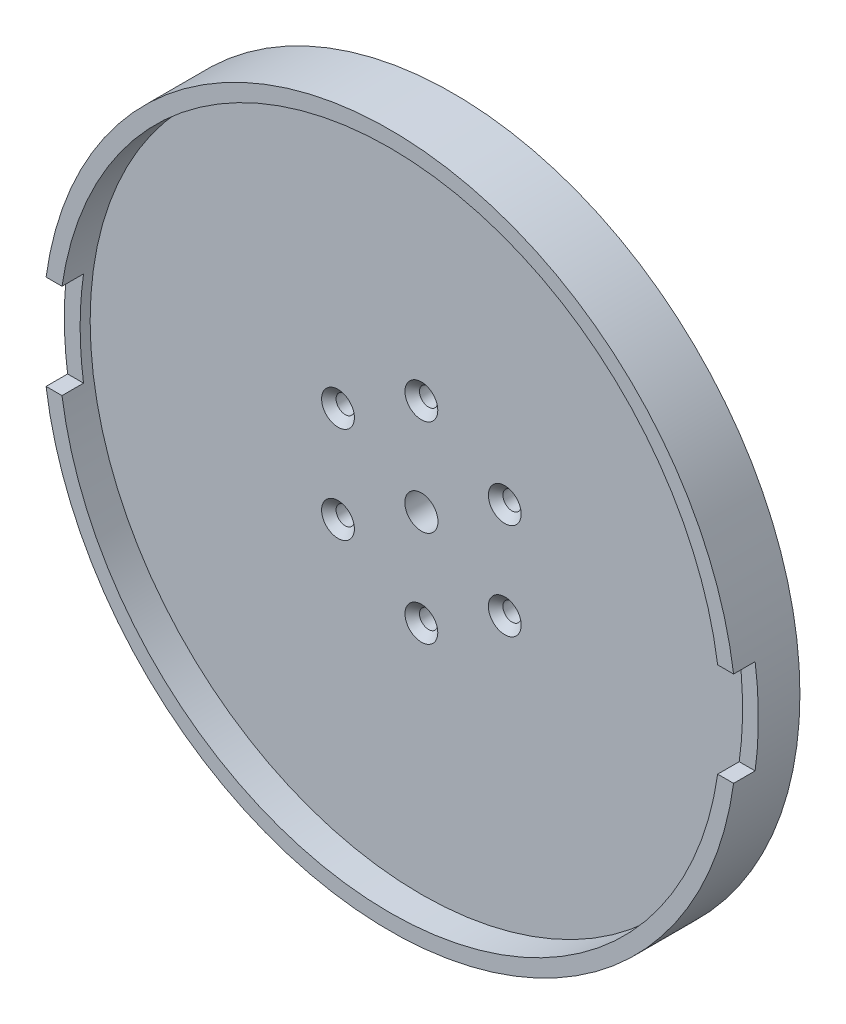
ISO-10303-21;
HEADER;
FILE_DESCRIPTION(('STEP AP214'),'2;1');
FILE_NAME('part.step','',(''),(''),'','','');
FILE_SCHEMA(('AUTOMOTIVE_DESIGN { 1 0 10303 214 1 1 1 1 }'));
ENDSEC;
DATA;
#1=APPLICATION_CONTEXT('core data for automotive mechanical design processes');
#2=APPLICATION_PROTOCOL_DEFINITION('international standard','automotive_design',2000,#1);
#3=PRODUCT_CONTEXT('',#1,'mechanical');
#4=PRODUCT('Part','Part','',(#3));
#5=PRODUCT_RELATED_PRODUCT_CATEGORY('part','',(#4));
#6=PRODUCT_DEFINITION_FORMATION('','',#4);
#7=PRODUCT_DEFINITION_CONTEXT('part definition',#1,'design');
#8=PRODUCT_DEFINITION('design','',#6,#7);
#9=PRODUCT_DEFINITION_SHAPE('','',#8);
#10=(LENGTH_UNIT() NAMED_UNIT(*) SI_UNIT(.MILLI.,.METRE.));
#11=(NAMED_UNIT(*) PLANE_ANGLE_UNIT() SI_UNIT($,.RADIAN.));
#12=(NAMED_UNIT(*) SI_UNIT($,.STERADIAN.) SOLID_ANGLE_UNIT());
#13=UNCERTAINTY_MEASURE_WITH_UNIT(LENGTH_MEASURE(1.E-05),#10,'distance_accuracy_value','');
#14=(GEOMETRIC_REPRESENTATION_CONTEXT(3) GLOBAL_UNCERTAINTY_ASSIGNED_CONTEXT((#13)) GLOBAL_UNIT_ASSIGNED_CONTEXT((#10,
#11,#12)) REPRESENTATION_CONTEXT('',''));
#15=CARTESIAN_POINT('',(0.,0.,0.));
#16=DIRECTION('',(0.,0.,1.));
#17=DIRECTION('',(1.,0.,0.));
#18=AXIS2_PLACEMENT_3D('',#15,#16,#17);
#19=CARTESIAN_POINT('',(0.,0.,10.));
#20=DIRECTION('',(0.,0.,-1.));
#21=DIRECTION('',(-1.,0.,0.));
#22=AXIS2_PLACEMENT_3D('',#19,#20,#21);
#23=PLANE('',#22);
#24=DIRECTION('',(1.,0.,0.));
#25=VECTOR('',#24,1.);
#26=CARTESIAN_POINT('',(-110.,-15.,10.));
#27=LINE('',#26,#25);
#28=CARTESIAN_POINT('',(-108.972473588517,-15.,10.));
#29=VERTEX_POINT('',#28);
#30=CARTESIAN_POINT('',(-103.923048454133,-15.,10.));
#31=VERTEX_POINT('',#30);
#32=EDGE_CURVE('E72',#29,#31,#27,.T.);
#33=ORIENTED_EDGE('',*,*,#32,.F.);
#34=CARTESIAN_POINT('',(0.,0.,10.));
#35=DIRECTION('',(0.,0.,-1.));
#36=DIRECTION('',(-1.,0.,0.));
#37=AXIS2_PLACEMENT_3D('',#34,#35,#36);
#38=CIRCLE('',#37,110.);
#39=CARTESIAN_POINT('',(108.972473588517,-15.,10.));
#40=VERTEX_POINT('',#39);
#41=EDGE_CURVE('E138',#40,#29,#38,.T.);
#42=ORIENTED_EDGE('',*,*,#41,.F.);
#43=CARTESIAN_POINT('',(103.923048454133,-15.,10.));
#44=VERTEX_POINT('',#43);
#45=EDGE_CURVE('E226',#44,#40,#27,.T.);
#46=ORIENTED_EDGE('',*,*,#45,.F.);
#47=CARTESIAN_POINT('',(0.,0.,10.));
#48=DIRECTION('',(0.,0.,-1.));
#49=DIRECTION('',(-1.,0.,0.));
#50=AXIS2_PLACEMENT_3D('',#47,#48,#49);
#51=CIRCLE('',#50,105.);
#52=EDGE_CURVE('E158',#44,#31,#51,.T.);
#53=ORIENTED_EDGE('',*,*,#52,.T.);
#54=EDGE_LOOP('',(#33,#42,#46,#53));
#55=FACE_BOUND('',#54,.T.);
#56=ADVANCED_FACE('F47',(#55),#23,.F.);
#57=CARTESIAN_POINT('',(0.,0.,10.));
#58=DIRECTION('',(0.,0.,-1.));
#59=DIRECTION('',(-1.,0.,0.));
#60=AXIS2_PLACEMENT_3D('',#57,#58,#59);
#61=CYLINDRICAL_SURFACE('',#60,110.);
#62=CARTESIAN_POINT('',(0.,0.,3.17499999999999));
#63=DIRECTION('',(0.,0.,-1.));
#64=DIRECTION('',(-1.,0.,0.));
#65=AXIS2_PLACEMENT_3D('',#62,#63,#64);
#66=CIRCLE('',#65,110.);
#67=CARTESIAN_POINT('',(108.972473588517,-15.,3.17499999999999));
#68=VERTEX_POINT('',#67);
#69=CARTESIAN_POINT('',(108.972473588517,15.,3.17499999999999));
#70=VERTEX_POINT('',#69);
#71=EDGE_CURVE('E125',#68,#70,#66,.F.);
#72=ORIENTED_EDGE('',*,*,#71,.F.);
#73=DIRECTION('',(0.,0.,-1.));
#74=VECTOR('',#73,1.);
#75=CARTESIAN_POINT('',(108.972473588517,-15.,10.));
#76=LINE('',#75,#74);
#77=EDGE_CURVE('E126',#68,#40,#76,.F.);
#78=ORIENTED_EDGE('',*,*,#77,.T.);
#79=ORIENTED_EDGE('',*,*,#41,.T.);
#80=DIRECTION('',(0.,0.,-1.));
#81=VECTOR('',#80,1.);
#82=CARTESIAN_POINT('',(-108.972473588517,-15.,10.));
#83=LINE('',#82,#81);
#84=CARTESIAN_POINT('',(-108.972473588517,-15.,3.17499999999999));
#85=VERTEX_POINT('',#84);
#86=EDGE_CURVE('E129',#29,#85,#83,.T.);
#87=ORIENTED_EDGE('',*,*,#86,.T.);
#88=CARTESIAN_POINT('',(-108.972473588517,15.,3.17499999999999));
#89=VERTEX_POINT('',#88);
#90=EDGE_CURVE('E114',#89,#85,#66,.F.);
#91=ORIENTED_EDGE('',*,*,#90,.F.);
#92=DIRECTION('',(0.,0.,-1.));
#93=VECTOR('',#92,1.);
#94=CARTESIAN_POINT('',(-108.972473588517,15.,10.));
#95=LINE('',#94,#93);
#96=CARTESIAN_POINT('',(-108.972473588517,15.,10.));
#97=VERTEX_POINT('',#96);
#98=EDGE_CURVE('E147',#97,#89,#95,.T.);
#99=ORIENTED_EDGE('',*,*,#98,.F.);
#100=CARTESIAN_POINT('',(108.972473588517,15.,10.));
#101=VERTEX_POINT('',#100);
#102=EDGE_CURVE('E162',#97,#101,#38,.T.);
#103=ORIENTED_EDGE('',*,*,#102,.T.);
#104=DIRECTION('',(0.,0.,-1.));
#105=VECTOR('',#104,1.);
#106=CARTESIAN_POINT('',(108.972473588517,15.,10.));
#107=LINE('',#106,#105);
#108=EDGE_CURVE('E149',#70,#101,#107,.F.);
#109=ORIENTED_EDGE('',*,*,#108,.F.);
#110=EDGE_LOOP('',(#72,#78,#79,#87,#91,#99,#103,#109));
#111=FACE_BOUND('',#110,.T.);
#112=CARTESIAN_POINT('',(0.,0.,-10.));
#113=DIRECTION('',(0.,0.,-1.));
#114=DIRECTION('',(-1.,0.,0.));
#115=AXIS2_PLACEMENT_3D('',#112,#113,#114);
#116=CIRCLE('',#115,110.);
#117=CARTESIAN_POINT('',(-110.,0.,-10.));
#118=VERTEX_POINT('',#117);
#119=EDGE_CURVE('E151',#118,#118,#116,.T.);
#120=ORIENTED_EDGE('',*,*,#119,.F.);
#121=EDGE_LOOP('',(#120));
#122=FACE_BOUND('',#121,.T.);
#123=ADVANCED_FACE('F49',(#111,#122),#61,.T.);
#124=ORIENTED_EDGE('',*,*,#102,.F.);
#125=DIRECTION('',(1.,0.,0.));
#126=VECTOR('',#125,1.);
#127=CARTESIAN_POINT('',(-110.,15.,10.));
#128=LINE('',#127,#126);
#129=CARTESIAN_POINT('',(-103.923048454133,15.,10.));
#130=VERTEX_POINT('',#129);
#131=EDGE_CURVE('E139',#97,#130,#128,.T.);
#132=ORIENTED_EDGE('',*,*,#131,.T.);
#133=CARTESIAN_POINT('',(103.923048454133,15.,10.));
#134=VERTEX_POINT('',#133);
#135=EDGE_CURVE('E155',#130,#134,#51,.T.);
#136=ORIENTED_EDGE('',*,*,#135,.T.);
#137=EDGE_CURVE('E143',#134,#101,#128,.T.);
#138=ORIENTED_EDGE('',*,*,#137,.T.);
#139=EDGE_LOOP('',(#124,#132,#136,#138));
#140=FACE_BOUND('',#139,.T.);
#141=ADVANCED_FACE('F236',(#140),#23,.F.);
#142=CARTESIAN_POINT('',(0.,0.,10.));
#143=DIRECTION('',(0.,0.,-1.));
#144=DIRECTION('',(-1.,0.,0.));
#145=AXIS2_PLACEMENT_3D('',#142,#143,#144);
#146=CYLINDRICAL_SURFACE('',#145,105.);
#147=CARTESIAN_POINT('',(0.,0.,3.17499999999999));
#148=DIRECTION('',(0.,0.,-1.));
#149=DIRECTION('',(-1.,0.,0.));
#150=AXIS2_PLACEMENT_3D('',#147,#148,#149);
#151=CIRCLE('',#150,105.);
#152=CARTESIAN_POINT('',(103.923048454133,-15.,3.17499999999999));
#153=VERTEX_POINT('',#152);
#154=CARTESIAN_POINT('',(103.923048454133,15.,3.17499999999999));
#155=VERTEX_POINT('',#154);
#156=EDGE_CURVE('E56',#153,#155,#151,.F.);
#157=ORIENTED_EDGE('',*,*,#156,.T.);
#158=DIRECTION('',(0.,0.,-1.));
#159=VECTOR('',#158,1.);
#160=CARTESIAN_POINT('',(103.923048454133,15.,10.));
#161=LINE('',#160,#159);
#162=EDGE_CURVE('E11',#155,#134,#161,.F.);
#163=ORIENTED_EDGE('',*,*,#162,.T.);
#164=ORIENTED_EDGE('',*,*,#135,.F.);
#165=DIRECTION('',(0.,0.,-1.));
#166=VECTOR('',#165,1.);
#167=CARTESIAN_POINT('',(-103.923048454133,15.,10.));
#168=LINE('',#167,#166);
#169=CARTESIAN_POINT('',(-103.923048454133,15.,3.17499999999999));
#170=VERTEX_POINT('',#169);
#171=EDGE_CURVE('E166',#130,#170,#168,.T.);
#172=ORIENTED_EDGE('',*,*,#171,.T.);
#173=CARTESIAN_POINT('',(-103.923048454133,-15.,3.17499999999999));
#174=VERTEX_POINT('',#173);
#175=EDGE_CURVE('E164',#170,#174,#151,.F.);
#176=ORIENTED_EDGE('',*,*,#175,.T.);
#177=DIRECTION('',(0.,0.,-1.));
#178=VECTOR('',#177,1.);
#179=CARTESIAN_POINT('',(-103.923048454133,-15.,10.));
#180=LINE('',#179,#178);
#181=EDGE_CURVE('E130',#31,#174,#180,.T.);
#182=ORIENTED_EDGE('',*,*,#181,.F.);
#183=ORIENTED_EDGE('',*,*,#52,.F.);
#184=DIRECTION('',(0.,0.,-1.));
#185=VECTOR('',#184,1.);
#186=CARTESIAN_POINT('',(103.923048454133,-15.,10.));
#187=LINE('',#186,#185);
#188=EDGE_CURVE('E169',#153,#44,#187,.F.);
#189=ORIENTED_EDGE('',*,*,#188,.F.);
#190=EDGE_LOOP('',(#157,#163,#164,#172,#176,#182,#183,#189));
#191=FACE_BOUND('',#190,.T.);
#192=CARTESIAN_POINT('',(0.,0.,0.));
#193=DIRECTION('',(0.,0.,-1.));
#194=DIRECTION('',(-1.,0.,0.));
#195=AXIS2_PLACEMENT_3D('',#192,#193,#194);
#196=CIRCLE('',#195,105.);
#197=CARTESIAN_POINT('',(-105.,0.,0.));
#198=VERTEX_POINT('',#197);
#199=EDGE_CURVE('E154',#198,#198,#196,.T.);
#200=ORIENTED_EDGE('',*,*,#199,.T.);
#201=EDGE_LOOP('',(#200));
#202=FACE_BOUND('',#201,.T.);
#203=ADVANCED_FACE('F241',(#191,#202),#146,.F.);
#204=CARTESIAN_POINT('',(0.,0.,0.));
#205=DIRECTION('',(0.,0.,-1.));
#206=DIRECTION('',(-1.,0.,0.));
#207=AXIS2_PLACEMENT_3D('',#204,#205,#206);
#208=PLANE('',#207);
#209=CARTESIAN_POINT('',(-26.4325902286166,-15.2624999999945,0.));
#210=DIRECTION('',(0.,0.,1.));
#211=DIRECTION('',(1.,0.,0.));
#212=AXIS2_PLACEMENT_3D('',#209,#210,#211);
#213=CIRCLE('',#212,5.2);
#214=CARTESIAN_POINT('',(-21.2325902286166,-15.2624999999945,0.));
#215=VERTEX_POINT('',#214);
#216=EDGE_CURVE('E504',#215,#215,#213,.T.);
#217=ORIENTED_EDGE('',*,*,#216,.F.);
#218=EDGE_LOOP('',(#217));
#219=FACE_BOUND('',#218,.T.);
#220=CARTESIAN_POINT('',(-26.4325902286102,15.2625000000056,0.));
#221=DIRECTION('',(0.,0.,1.));
#222=DIRECTION('',(1.,0.,0.));
#223=AXIS2_PLACEMENT_3D('',#220,#221,#222);
#224=CIRCLE('',#223,5.2);
#225=CARTESIAN_POINT('',(-21.2325902286102,15.2625000000056,0.));
#226=VERTEX_POINT('',#225);
#227=EDGE_CURVE('E199',#226,#226,#224,.T.);
#228=ORIENTED_EDGE('',*,*,#227,.F.);
#229=EDGE_LOOP('',(#228));
#230=FACE_BOUND('',#229,.T.);
#231=CARTESIAN_POINT('',(0.00283522191306396,30.525,0.));
#232=DIRECTION('',(0.,0.,1.));
#233=DIRECTION('',(1.,0.,0.));
#234=AXIS2_PLACEMENT_3D('',#231,#232,#233);
#235=CIRCLE('',#234,5.2);
#236=CARTESIAN_POINT('',(5.20283522191306,30.525,0.));
#237=VERTEX_POINT('',#236);
#238=EDGE_CURVE('E192',#237,#237,#235,.T.);
#239=ORIENTED_EDGE('',*,*,#238,.F.);
#240=EDGE_LOOP('',(#239));
#241=FACE_BOUND('',#240,.T.);
#242=CARTESIAN_POINT('',(26.4382606724299,15.2624999999943,0.));
#243=DIRECTION('',(0.,0.,1.));
#244=DIRECTION('',(1.,0.,0.));
#245=AXIS2_PLACEMENT_3D('',#242,#243,#244);
#246=CIRCLE('',#245,5.2);
#247=CARTESIAN_POINT('',(31.6382606724299,15.2624999999943,0.));
#248=VERTEX_POINT('',#247);
#249=EDGE_CURVE('E188',#248,#248,#246,.T.);
#250=ORIENTED_EDGE('',*,*,#249,.F.);
#251=EDGE_LOOP('',(#250));
#252=FACE_BOUND('',#251,.T.);
#253=CARTESIAN_POINT('',(26.4382606724233,-15.2625000000057,0.));
#254=DIRECTION('',(0.,0.,1.));
#255=DIRECTION('',(1.,0.,0.));
#256=AXIS2_PLACEMENT_3D('',#253,#254,#255);
#257=CIRCLE('',#256,5.2);
#258=CARTESIAN_POINT('',(31.6382606724233,-15.2625000000057,0.));
#259=VERTEX_POINT('',#258);
#260=EDGE_CURVE('E184',#259,#259,#257,.T.);
#261=ORIENTED_EDGE('',*,*,#260,.F.);
#262=EDGE_LOOP('',(#261));
#263=FACE_BOUND('',#262,.T.);
#264=CARTESIAN_POINT('',(0.00283522189989047,-30.525,0.));
#265=DIRECTION('',(0.,0.,1.));
#266=DIRECTION('',(1.,0.,0.));
#267=AXIS2_PLACEMENT_3D('',#264,#265,#266);
#268=CIRCLE('',#267,5.2);
#269=CARTESIAN_POINT('',(5.20283522189989,-30.525,0.));
#270=VERTEX_POINT('',#269);
#271=EDGE_CURVE('E179',#270,#270,#268,.T.);
#272=ORIENTED_EDGE('',*,*,#271,.F.);
#273=EDGE_LOOP('',(#272));
#274=FACE_BOUND('',#273,.T.);
#275=CARTESIAN_POINT('',(0.00283522190658303,0.,0.));
#276=DIRECTION('',(0.,0.,1.));
#277=DIRECTION('',(1.,0.,0.));
#278=AXIS2_PLACEMENT_3D('',#275,#276,#277);
#279=CIRCLE('',#278,5.25);
#280=CARTESIAN_POINT('',(5.25283522190659,0.,0.));
#281=VERTEX_POINT('',#280);
#282=EDGE_CURVE('E174',#281,#281,#279,.T.);
#283=ORIENTED_EDGE('',*,*,#282,.F.);
#284=EDGE_LOOP('',(#283));
#285=FACE_BOUND('',#284,.T.);
#286=ORIENTED_EDGE('',*,*,#199,.F.);
#287=EDGE_LOOP('',(#286));
#288=FACE_BOUND('',#287,.T.);
#289=ADVANCED_FACE('F278',(#219,#230,#241,#252,#263,#274,#285,#288),#208,.F.);
#290=CARTESIAN_POINT('',(0.,0.,-10.));
#291=DIRECTION('',(0.,0.,-1.));
#292=DIRECTION('',(-1.,0.,0.));
#293=AXIS2_PLACEMENT_3D('',#290,#291,#292);
#294=PLANE('',#293);
#295=CARTESIAN_POINT('',(-26.4325902286166,-15.2624999999945,-10.));
#296=DIRECTION('',(0.,0.,-1.));
#297=DIRECTION('',(-1.,0.,0.));
#298=AXIS2_PLACEMENT_3D('',#295,#296,#297);
#299=CIRCLE('',#298,2.89999999999999);
#300=CARTESIAN_POINT('',(-29.3325902286166,-15.2624999999945,-10.));
#301=VERTEX_POINT('',#300);
#302=EDGE_CURVE('E51',#301,#301,#299,.T.);
#303=ORIENTED_EDGE('',*,*,#302,.F.);
#304=EDGE_LOOP('',(#303));
#305=FACE_BOUND('',#304,.T.);
#306=CARTESIAN_POINT('',(-26.4325902286102,15.2625000000056,-10.));
#307=DIRECTION('',(0.,0.,-1.));
#308=DIRECTION('',(-1.,0.,0.));
#309=AXIS2_PLACEMENT_3D('',#306,#307,#308);
#310=CIRCLE('',#309,2.89999999999999);
#311=CARTESIAN_POINT('',(-29.3325902286102,15.2625000000056,-10.));
#312=VERTEX_POINT('',#311);
#313=EDGE_CURVE('E190',#312,#312,#310,.T.);
#314=ORIENTED_EDGE('',*,*,#313,.F.);
#315=EDGE_LOOP('',(#314));
#316=FACE_BOUND('',#315,.T.);
#317=CARTESIAN_POINT('',(0.00283522191306396,30.525,-10.));
#318=DIRECTION('',(0.,0.,-1.));
#319=DIRECTION('',(-1.,0.,0.));
#320=AXIS2_PLACEMENT_3D('',#317,#318,#319);
#321=CIRCLE('',#320,2.89999999999999);
#322=CARTESIAN_POINT('',(-2.89716477808693,30.525,-10.));
#323=VERTEX_POINT('',#322);
#324=EDGE_CURVE('E186',#323,#323,#321,.T.);
#325=ORIENTED_EDGE('',*,*,#324,.F.);
#326=EDGE_LOOP('',(#325));
#327=FACE_BOUND('',#326,.T.);
#328=CARTESIAN_POINT('',(26.4382606724299,15.2624999999943,-10.));
#329=DIRECTION('',(0.,0.,-1.));
#330=DIRECTION('',(-1.,0.,0.));
#331=AXIS2_PLACEMENT_3D('',#328,#329,#330);
#332=CIRCLE('',#331,2.89999999999999);
#333=CARTESIAN_POINT('',(23.5382606724299,15.2624999999943,-10.));
#334=VERTEX_POINT('',#333);
#335=EDGE_CURVE('E181',#334,#334,#332,.T.);
#336=ORIENTED_EDGE('',*,*,#335,.F.);
#337=EDGE_LOOP('',(#336));
#338=FACE_BOUND('',#337,.T.);
#339=CARTESIAN_POINT('',(26.4382606724233,-15.2625000000057,-10.));
#340=DIRECTION('',(0.,0.,-1.));
#341=DIRECTION('',(-1.,0.,0.));
#342=AXIS2_PLACEMENT_3D('',#339,#340,#341);
#343=CIRCLE('',#342,2.89999999999999);
#344=CARTESIAN_POINT('',(23.5382606724233,-15.2625000000057,-10.));
#345=VERTEX_POINT('',#344);
#346=EDGE_CURVE('E176',#345,#345,#343,.T.);
#347=ORIENTED_EDGE('',*,*,#346,.F.);
#348=EDGE_LOOP('',(#347));
#349=FACE_BOUND('',#348,.T.);
#350=CARTESIAN_POINT('',(0.00283522189989047,-30.525,-10.));
#351=DIRECTION('',(0.,0.,-1.));
#352=DIRECTION('',(-1.,0.,0.));
#353=AXIS2_PLACEMENT_3D('',#350,#351,#352);
#354=CIRCLE('',#353,2.89999999999999);
#355=CARTESIAN_POINT('',(-2.8971647781001,-30.525,-10.));
#356=VERTEX_POINT('',#355);
#357=EDGE_CURVE('E171',#356,#356,#354,.T.);
#358=ORIENTED_EDGE('',*,*,#357,.F.);
#359=EDGE_LOOP('',(#358));
#360=FACE_BOUND('',#359,.T.);
#361=CARTESIAN_POINT('',(0.00283522190658303,0.,-10.));
#362=DIRECTION('',(0.,0.,-1.));
#363=DIRECTION('',(-1.,0.,0.));
#364=AXIS2_PLACEMENT_3D('',#361,#362,#363);
#365=CIRCLE('',#364,5.25);
#366=CARTESIAN_POINT('',(-5.24716477809342,0.,-10.));
#367=VERTEX_POINT('',#366);
#368=EDGE_CURVE('E223',#367,#367,#365,.F.);
#369=ORIENTED_EDGE('',*,*,#368,.T.);
#370=EDGE_LOOP('',(#369));
#371=FACE_BOUND('',#370,.T.);
#372=ORIENTED_EDGE('',*,*,#119,.T.);
#373=EDGE_LOOP('',(#372));
#374=FACE_BOUND('',#373,.T.);
#375=ADVANCED_FACE('F265',(#305,#316,#327,#338,#349,#360,#371,#374),#294,.T.);
#376=CARTESIAN_POINT('',(-110.,-15.,3.17499999999999));
#377=DIRECTION('',(0.,1.,0.));
#378=DIRECTION('',(0.,0.,1.));
#379=AXIS2_PLACEMENT_3D('',#376,#377,#378);
#380=PLANE('',#379);
#381=ORIENTED_EDGE('',*,*,#32,.T.);
#382=ORIENTED_EDGE('',*,*,#181,.T.);
#383=DIRECTION('',(1.,0.,0.));
#384=VECTOR('',#383,1.);
#385=CARTESIAN_POINT('',(-110.,-15.,3.17499999999999));
#386=LINE('',#385,#384);
#387=EDGE_CURVE('E117',#85,#174,#386,.T.);
#388=ORIENTED_EDGE('',*,*,#387,.F.);
#389=ORIENTED_EDGE('',*,*,#86,.F.);
#390=EDGE_LOOP('',(#381,#382,#388,#389));
#391=FACE_BOUND('',#390,.T.);
#392=ADVANCED_FACE('F128',(#391),#380,.T.);
#393=CARTESIAN_POINT('',(-110.,-15.,3.17499999999999));
#394=DIRECTION('',(0.,0.,-1.));
#395=DIRECTION('',(-1.,0.,0.));
#396=AXIS2_PLACEMENT_3D('',#393,#394,#395);
#397=PLANE('',#396);
#398=ORIENTED_EDGE('',*,*,#90,.T.);
#399=ORIENTED_EDGE('',*,*,#387,.T.);
#400=ORIENTED_EDGE('',*,*,#175,.F.);
#401=DIRECTION('',(1.,0.,0.));
#402=VECTOR('',#401,1.);
#403=CARTESIAN_POINT('',(-110.,15.,3.17499999999999));
#404=LINE('',#403,#402);
#405=EDGE_CURVE('E120',#89,#170,#404,.T.);
#406=ORIENTED_EDGE('',*,*,#405,.F.);
#407=EDGE_LOOP('',(#398,#399,#400,#406));
#408=FACE_BOUND('',#407,.T.);
#409=ADVANCED_FACE('F116',(#408),#397,.F.);
#410=CARTESIAN_POINT('',(-110.,15.,3.17499999999999));
#411=DIRECTION('',(0.,1.,0.));
#412=DIRECTION('',(0.,0.,1.));
#413=AXIS2_PLACEMENT_3D('',#410,#411,#412);
#414=PLANE('',#413);
#415=ORIENTED_EDGE('',*,*,#98,.T.);
#416=ORIENTED_EDGE('',*,*,#405,.T.);
#417=ORIENTED_EDGE('',*,*,#171,.F.);
#418=ORIENTED_EDGE('',*,*,#131,.F.);
#419=EDGE_LOOP('',(#415,#416,#417,#418));
#420=FACE_BOUND('',#419,.T.);
#421=ADVANCED_FACE('F238',(#420),#414,.F.);
#422=ORIENTED_EDGE('',*,*,#108,.T.);
#423=ORIENTED_EDGE('',*,*,#137,.F.);
#424=ORIENTED_EDGE('',*,*,#162,.F.);
#425=EDGE_CURVE('E131',#155,#70,#404,.T.);
#426=ORIENTED_EDGE('',*,*,#425,.T.);
#427=EDGE_LOOP('',(#422,#423,#424,#426));
#428=FACE_BOUND('',#427,.T.);
#429=ADVANCED_FACE('F244',(#428),#414,.F.);
#430=ORIENTED_EDGE('',*,*,#71,.T.);
#431=ORIENTED_EDGE('',*,*,#425,.F.);
#432=ORIENTED_EDGE('',*,*,#156,.F.);
#433=EDGE_CURVE('E64',#153,#68,#386,.T.);
#434=ORIENTED_EDGE('',*,*,#433,.T.);
#435=EDGE_LOOP('',(#430,#431,#432,#434));
#436=FACE_BOUND('',#435,.T.);
#437=ADVANCED_FACE('F246',(#436),#397,.F.);
#438=ORIENTED_EDGE('',*,*,#433,.F.);
#439=ORIENTED_EDGE('',*,*,#188,.T.);
#440=ORIENTED_EDGE('',*,*,#45,.T.);
#441=ORIENTED_EDGE('',*,*,#77,.F.);
#442=EDGE_LOOP('',(#438,#439,#440,#441));
#443=FACE_BOUND('',#442,.T.);
#444=ADVANCED_FACE('F251',(#443),#380,.T.);
#445=CARTESIAN_POINT('',(0.00283522190658303,0.,-24.8492424049175));
#446=DIRECTION('',(0.,0.,1.));
#447=DIRECTION('',(1.,0.,0.));
#448=AXIS2_PLACEMENT_3D('',#445,#446,#447);
#449=CYLINDRICAL_SURFACE('',#448,5.25);
#450=ORIENTED_EDGE('',*,*,#282,.T.);
#451=EDGE_LOOP('',(#450));
#452=FACE_BOUND('',#451,.T.);
#453=ORIENTED_EDGE('',*,*,#368,.F.);
#454=EDGE_LOOP('',(#453));
#455=FACE_BOUND('',#454,.T.);
#456=ADVANCED_FACE('F253',(#452,#455),#449,.F.);
#457=CARTESIAN_POINT('',(0.00283522189989047,-30.525,0.));
#458=DIRECTION('',(0.,0.,1.));
#459=DIRECTION('',(1.,0.,0.));
#460=AXIS2_PLACEMENT_3D('',#457,#458,#459);
#461=CYLINDRICAL_SURFACE('',#460,2.89999999999999);
#462=ORIENTED_EDGE('',*,*,#357,.T.);
#463=EDGE_LOOP('',(#462));
#464=FACE_BOUND('',#463,.T.);
#465=CARTESIAN_POINT('',(0.00283522189989047,-30.525,-2.3));
#466=DIRECTION('',(0.,0.,1.));
#467=DIRECTION('',(1.,0.,0.));
#468=AXIS2_PLACEMENT_3D('',#465,#466,#467);
#469=CIRCLE('',#468,2.9);
#470=CARTESIAN_POINT('',(2.90283522189989,-30.525,-2.3));
#471=VERTEX_POINT('',#470);
#472=EDGE_CURVE('E175',#471,#471,#469,.T.);
#473=ORIENTED_EDGE('',*,*,#472,.T.);
#474=EDGE_LOOP('',(#473));
#475=FACE_BOUND('',#474,.T.);
#476=ADVANCED_FACE('F260',(#464,#475),#461,.F.);
#477=CARTESIAN_POINT('',(0.00283522189989047,-30.525,0.));
#478=DIRECTION('',(0.,0.,1.));
#479=DIRECTION('',(1.,0.,0.));
#480=AXIS2_PLACEMENT_3D('',#477,#478,#479);
#481=CONICAL_SURFACE('',#480,5.2,0.785398163397448);
#482=ORIENTED_EDGE('',*,*,#472,.F.);
#483=EDGE_LOOP('',(#482));
#484=FACE_BOUND('',#483,.T.);
#485=ORIENTED_EDGE('',*,*,#271,.T.);
#486=EDGE_LOOP('',(#485));
#487=FACE_BOUND('',#486,.T.);
#488=ADVANCED_FACE('F354',(#484,#487),#481,.F.);
#489=CARTESIAN_POINT('',(26.4382606724233,-15.2625000000057,0.));
#490=DIRECTION('',(0.,0.,1.));
#491=DIRECTION('',(1.,0.,0.));
#492=AXIS2_PLACEMENT_3D('',#489,#490,#491);
#493=CYLINDRICAL_SURFACE('',#492,2.89999999999999);
#494=ORIENTED_EDGE('',*,*,#346,.T.);
#495=EDGE_LOOP('',(#494));
#496=FACE_BOUND('',#495,.T.);
#497=CARTESIAN_POINT('',(26.4382606724233,-15.2625000000057,-2.3));
#498=DIRECTION('',(0.,0.,1.));
#499=DIRECTION('',(1.,0.,0.));
#500=AXIS2_PLACEMENT_3D('',#497,#498,#499);
#501=CIRCLE('',#500,2.9);
#502=CARTESIAN_POINT('',(29.3382606724233,-15.2625000000057,-2.3));
#503=VERTEX_POINT('',#502);
#504=EDGE_CURVE('E180',#503,#503,#501,.T.);
#505=ORIENTED_EDGE('',*,*,#504,.T.);
#506=EDGE_LOOP('',(#505));
#507=FACE_BOUND('',#506,.T.);
#508=ADVANCED_FACE('F362',(#496,#507),#493,.F.);
#509=CARTESIAN_POINT('',(26.4382606724233,-15.2625000000057,0.));
#510=DIRECTION('',(0.,0.,1.));
#511=DIRECTION('',(1.,0.,0.));
#512=AXIS2_PLACEMENT_3D('',#509,#510,#511);
#513=CONICAL_SURFACE('',#512,5.2,0.785398163397448);
#514=ORIENTED_EDGE('',*,*,#504,.F.);
#515=EDGE_LOOP('',(#514));
#516=FACE_BOUND('',#515,.T.);
#517=ORIENTED_EDGE('',*,*,#260,.T.);
#518=EDGE_LOOP('',(#517));
#519=FACE_BOUND('',#518,.T.);
#520=ADVANCED_FACE('F371',(#516,#519),#513,.F.);
#521=CARTESIAN_POINT('',(26.4382606724299,15.2624999999943,0.));
#522=DIRECTION('',(0.,0.,1.));
#523=DIRECTION('',(1.,0.,0.));
#524=AXIS2_PLACEMENT_3D('',#521,#522,#523);
#525=CYLINDRICAL_SURFACE('',#524,2.89999999999999);
#526=ORIENTED_EDGE('',*,*,#335,.T.);
#527=EDGE_LOOP('',(#526));
#528=FACE_BOUND('',#527,.T.);
#529=CARTESIAN_POINT('',(26.4382606724299,15.2624999999943,-2.3));
#530=DIRECTION('',(0.,0.,1.));
#531=DIRECTION('',(1.,0.,0.));
#532=AXIS2_PLACEMENT_3D('',#529,#530,#531);
#533=CIRCLE('',#532,2.9);
#534=CARTESIAN_POINT('',(29.3382606724299,15.2624999999943,-2.3));
#535=VERTEX_POINT('',#534);
#536=EDGE_CURVE('E185',#535,#535,#533,.T.);
#537=ORIENTED_EDGE('',*,*,#536,.T.);
#538=EDGE_LOOP('',(#537));
#539=FACE_BOUND('',#538,.T.);
#540=ADVANCED_FACE('F380',(#528,#539),#525,.F.);
#541=CARTESIAN_POINT('',(26.4382606724299,15.2624999999943,0.));
#542=DIRECTION('',(0.,0.,1.));
#543=DIRECTION('',(1.,0.,0.));
#544=AXIS2_PLACEMENT_3D('',#541,#542,#543);
#545=CONICAL_SURFACE('',#544,5.2,0.785398163397448);
#546=ORIENTED_EDGE('',*,*,#536,.F.);
#547=EDGE_LOOP('',(#546));
#548=FACE_BOUND('',#547,.T.);
#549=ORIENTED_EDGE('',*,*,#249,.T.);
#550=EDGE_LOOP('',(#549));
#551=FACE_BOUND('',#550,.T.);
#552=ADVANCED_FACE('F389',(#548,#551),#545,.F.);
#553=CARTESIAN_POINT('',(0.00283522191306396,30.525,0.));
#554=DIRECTION('',(0.,0.,1.));
#555=DIRECTION('',(1.,0.,0.));
#556=AXIS2_PLACEMENT_3D('',#553,#554,#555);
#557=CYLINDRICAL_SURFACE('',#556,2.89999999999999);
#558=ORIENTED_EDGE('',*,*,#324,.T.);
#559=EDGE_LOOP('',(#558));
#560=FACE_BOUND('',#559,.T.);
#561=CARTESIAN_POINT('',(0.00283522191306396,30.525,-2.3));
#562=DIRECTION('',(0.,0.,1.));
#563=DIRECTION('',(1.,0.,0.));
#564=AXIS2_PLACEMENT_3D('',#561,#562,#563);
#565=CIRCLE('',#564,2.9);
#566=CARTESIAN_POINT('',(2.90283522191306,30.525,-2.3));
#567=VERTEX_POINT('',#566);
#568=EDGE_CURVE('E189',#567,#567,#565,.T.);
#569=ORIENTED_EDGE('',*,*,#568,.T.);
#570=EDGE_LOOP('',(#569));
#571=FACE_BOUND('',#570,.T.);
#572=ADVANCED_FACE('F398',(#560,#571),#557,.F.);
#573=CARTESIAN_POINT('',(0.00283522191306396,30.525,0.));
#574=DIRECTION('',(0.,0.,1.));
#575=DIRECTION('',(1.,0.,0.));
#576=AXIS2_PLACEMENT_3D('',#573,#574,#575);
#577=CONICAL_SURFACE('',#576,5.2,0.785398163397448);
#578=ORIENTED_EDGE('',*,*,#568,.F.);
#579=EDGE_LOOP('',(#578));
#580=FACE_BOUND('',#579,.T.);
#581=ORIENTED_EDGE('',*,*,#238,.T.);
#582=EDGE_LOOP('',(#581));
#583=FACE_BOUND('',#582,.T.);
#584=ADVANCED_FACE('F407',(#580,#583),#577,.F.);
#585=CARTESIAN_POINT('',(-26.4325902286102,15.2625000000056,0.));
#586=DIRECTION('',(0.,0.,1.));
#587=DIRECTION('',(1.,0.,0.));
#588=AXIS2_PLACEMENT_3D('',#585,#586,#587);
#589=CYLINDRICAL_SURFACE('',#588,2.89999999999999);
#590=ORIENTED_EDGE('',*,*,#313,.T.);
#591=EDGE_LOOP('',(#590));
#592=FACE_BOUND('',#591,.T.);
#593=CARTESIAN_POINT('',(-26.4325902286102,15.2625000000056,-2.3));
#594=DIRECTION('',(0.,0.,1.));
#595=DIRECTION('',(1.,0.,0.));
#596=AXIS2_PLACEMENT_3D('',#593,#594,#595);
#597=CIRCLE('',#596,2.9);
#598=CARTESIAN_POINT('',(-23.5325902286102,15.2625000000056,-2.3));
#599=VERTEX_POINT('',#598);
#600=EDGE_CURVE('E193',#599,#599,#597,.T.);
#601=ORIENTED_EDGE('',*,*,#600,.T.);
#602=EDGE_LOOP('',(#601));
#603=FACE_BOUND('',#602,.T.);
#604=ADVANCED_FACE('F416',(#592,#603),#589,.F.);
#605=CARTESIAN_POINT('',(-26.4325902286102,15.2625000000056,0.));
#606=DIRECTION('',(0.,0.,1.));
#607=DIRECTION('',(1.,0.,0.));
#608=AXIS2_PLACEMENT_3D('',#605,#606,#607);
#609=CONICAL_SURFACE('',#608,5.2,0.785398163397448);
#610=ORIENTED_EDGE('',*,*,#600,.F.);
#611=EDGE_LOOP('',(#610));
#612=FACE_BOUND('',#611,.T.);
#613=ORIENTED_EDGE('',*,*,#227,.T.);
#614=EDGE_LOOP('',(#613));
#615=FACE_BOUND('',#614,.T.);
#616=ADVANCED_FACE('F425',(#612,#615),#609,.F.);
#617=CARTESIAN_POINT('',(-26.4325902286166,-15.2624999999945,0.));
#618=DIRECTION('',(0.,0.,1.));
#619=DIRECTION('',(1.,0.,0.));
#620=AXIS2_PLACEMENT_3D('',#617,#618,#619);
#621=CYLINDRICAL_SURFACE('',#620,2.89999999999999);
#622=ORIENTED_EDGE('',*,*,#302,.T.);
#623=EDGE_LOOP('',(#622));
#624=FACE_BOUND('',#623,.T.);
#625=CARTESIAN_POINT('',(-26.4325902286166,-15.2624999999945,-2.3));
#626=DIRECTION('',(0.,0.,1.));
#627=DIRECTION('',(1.,0.,0.));
#628=AXIS2_PLACEMENT_3D('',#625,#626,#627);
#629=CIRCLE('',#628,2.9);
#630=CARTESIAN_POINT('',(-23.5325902286166,-15.2624999999945,-2.3));
#631=VERTEX_POINT('',#630);
#632=EDGE_CURVE('E501',#631,#631,#629,.T.);
#633=ORIENTED_EDGE('',*,*,#632,.T.);
#634=EDGE_LOOP('',(#633));
#635=FACE_BOUND('',#634,.T.);
#636=ADVANCED_FACE('F433',(#624,#635),#621,.F.);
#637=CARTESIAN_POINT('',(-26.4325902286166,-15.2624999999945,0.));
#638=DIRECTION('',(0.,0.,1.));
#639=DIRECTION('',(1.,0.,0.));
#640=AXIS2_PLACEMENT_3D('',#637,#638,#639);
#641=CONICAL_SURFACE('',#640,5.2,0.785398163397448);
#642=ORIENTED_EDGE('',*,*,#632,.F.);
#643=EDGE_LOOP('',(#642));
#644=FACE_BOUND('',#643,.T.);
#645=ORIENTED_EDGE('',*,*,#216,.T.);
#646=EDGE_LOOP('',(#645));
#647=FACE_BOUND('',#646,.T.);
#648=ADVANCED_FACE('F442',(#644,#647),#641,.F.);
#649=CLOSED_SHELL('',(#56,#123,#141,#203,#289,#375,#392,#409,#421,#429,#437,#444,#456,#476,#488,
#508,#520,#540,#552,#572,#584,#604,#616,#636,#648));
#650=MANIFOLD_SOLID_BREP('B2',#649);
#651=ADVANCED_BREP_SHAPE_REPRESENTATION('',(#18,#650),#14);
#652=SHAPE_DEFINITION_REPRESENTATION(#9,#651);
ENDSEC;
END-ISO-10303-21;
